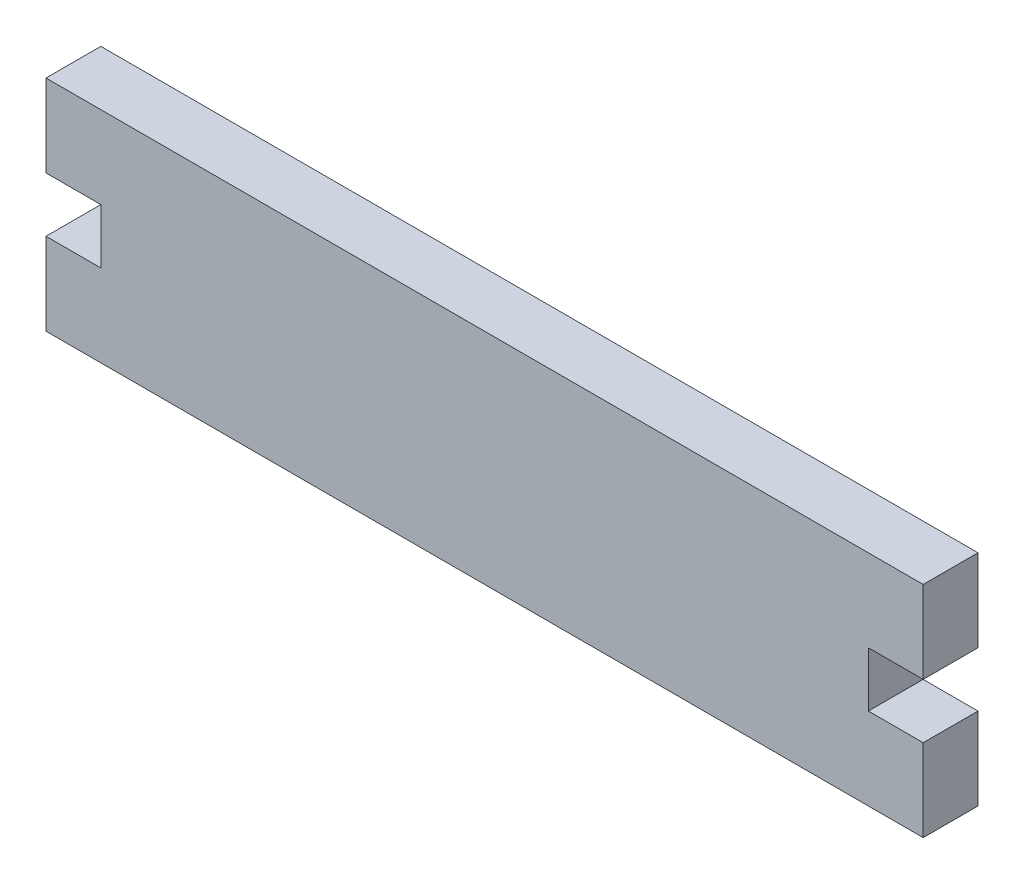
ISO-10303-21;
HEADER;
FILE_DESCRIPTION(('STEP AP214'),'2;1');
FILE_NAME('part.step','',(''),(''),'','','');
FILE_SCHEMA(('AUTOMOTIVE_DESIGN { 1 0 10303 214 1 1 1 1 }'));
ENDSEC;
DATA;
#1=APPLICATION_CONTEXT('core data for automotive mechanical design processes');
#2=APPLICATION_PROTOCOL_DEFINITION('international standard','automotive_design',2000,#1);
#3=PRODUCT_CONTEXT('',#1,'mechanical');
#4=PRODUCT('Part','Part','',(#3));
#5=PRODUCT_RELATED_PRODUCT_CATEGORY('part','',(#4));
#6=PRODUCT_DEFINITION_FORMATION('','',#4);
#7=PRODUCT_DEFINITION_CONTEXT('part definition',#1,'design');
#8=PRODUCT_DEFINITION('design','',#6,#7);
#9=PRODUCT_DEFINITION_SHAPE('','',#8);
#10=(LENGTH_UNIT() NAMED_UNIT(*) SI_UNIT(.MILLI.,.METRE.));
#11=(NAMED_UNIT(*) PLANE_ANGLE_UNIT() SI_UNIT($,.RADIAN.));
#12=(NAMED_UNIT(*) SI_UNIT($,.STERADIAN.) SOLID_ANGLE_UNIT());
#13=UNCERTAINTY_MEASURE_WITH_UNIT(LENGTH_MEASURE(1.E-05),#10,'distance_accuracy_value','');
#14=(GEOMETRIC_REPRESENTATION_CONTEXT(3) GLOBAL_UNCERTAINTY_ASSIGNED_CONTEXT((#13)) GLOBAL_UNIT_ASSIGNED_CONTEXT((#10,
#11,#12)) REPRESENTATION_CONTEXT('',''));
#15=CARTESIAN_POINT('',(0.,0.,0.));
#16=DIRECTION('',(0.,0.,1.));
#17=DIRECTION('',(1.,0.,0.));
#18=AXIS2_PLACEMENT_3D('',#15,#16,#17);
#19=CARTESIAN_POINT('',(70.,0.,5.));
#20=DIRECTION('',(0.,1.,0.));
#21=DIRECTION('',(-1.,0.,0.));
#22=AXIS2_PLACEMENT_3D('',#19,#20,#21);
#23=PLANE('',#22);
#24=DIRECTION('',(1.,0.,0.));
#25=VECTOR('',#24,1.);
#26=CARTESIAN_POINT('',(70.,0.,0.));
#27=LINE('',#26,#25);
#28=CARTESIAN_POINT('',(-5.,0.,0.));
#29=VERTEX_POINT('',#28);
#30=CARTESIAN_POINT('',(75.,0.,0.));
#31=VERTEX_POINT('',#30);
#32=EDGE_CURVE('E97',#29,#31,#27,.T.);
#33=ORIENTED_EDGE('',*,*,#32,.T.);
#34=DIRECTION('',(0.,0.,-1.));
#35=VECTOR('',#34,1.);
#36=CARTESIAN_POINT('',(75.,0.,5.));
#37=LINE('',#36,#35);
#38=CARTESIAN_POINT('',(75.,0.,5.));
#39=VERTEX_POINT('',#38);
#40=EDGE_CURVE('E11',#39,#31,#37,.T.);
#41=ORIENTED_EDGE('',*,*,#40,.F.);
#42=DIRECTION('',(1.,0.,0.));
#43=VECTOR('',#42,1.);
#44=CARTESIAN_POINT('',(0.,0.,5.));
#45=LINE('',#44,#43);
#46=CARTESIAN_POINT('',(-5.,0.,5.));
#47=VERTEX_POINT('',#46);
#48=EDGE_CURVE('E103',#47,#39,#45,.T.);
#49=ORIENTED_EDGE('',*,*,#48,.F.);
#50=DIRECTION('',(0.,0.,-1.));
#51=VECTOR('',#50,1.);
#52=CARTESIAN_POINT('',(-5.,0.,5.));
#53=LINE('',#52,#51);
#54=EDGE_CURVE('E149',#47,#29,#53,.T.);
#55=ORIENTED_EDGE('',*,*,#54,.T.);
#56=EDGE_LOOP('',(#33,#41,#49,#55));
#57=FACE_BOUND('',#56,.T.);
#58=ADVANCED_FACE('F33',(#57),#23,.F.);
#59=CARTESIAN_POINT('',(75.,0.,5.));
#60=DIRECTION('',(-1.,0.,0.));
#61=DIRECTION('',(0.,0.,1.));
#62=AXIS2_PLACEMENT_3D('',#59,#60,#61);
#63=PLANE('',#62);
#64=DIRECTION('',(0.,1.,0.));
#65=VECTOR('',#64,1.);
#66=CARTESIAN_POINT('',(75.,0.,0.));
#67=LINE('',#66,#65);
#68=CARTESIAN_POINT('',(75.,7.5,0.));
#69=VERTEX_POINT('',#68);
#70=EDGE_CURVE('E154',#31,#69,#67,.T.);
#71=ORIENTED_EDGE('',*,*,#70,.T.);
#72=DIRECTION('',(0.,0.,-1.));
#73=VECTOR('',#72,1.);
#74=CARTESIAN_POINT('',(75.,7.5,5.));
#75=LINE('',#74,#73);
#76=CARTESIAN_POINT('',(75.,7.5,5.));
#77=VERTEX_POINT('',#76);
#78=EDGE_CURVE('E41',#77,#69,#75,.T.);
#79=ORIENTED_EDGE('',*,*,#78,.F.);
#80=DIRECTION('',(0.,1.,0.));
#81=VECTOR('',#80,1.);
#82=CARTESIAN_POINT('',(75.,0.,5.));
#83=LINE('',#82,#81);
#84=EDGE_CURVE('E243',#39,#77,#83,.T.);
#85=ORIENTED_EDGE('',*,*,#84,.F.);
#86=ORIENTED_EDGE('',*,*,#40,.T.);
#87=EDGE_LOOP('',(#71,#79,#85,#86));
#88=FACE_BOUND('',#87,.T.);
#89=ADVANCED_FACE('F246',(#88),#63,.F.);
#90=CARTESIAN_POINT('',(70.,7.5,5.));
#91=DIRECTION('',(0.,-1.,0.));
#92=DIRECTION('',(1.,0.,0.));
#93=AXIS2_PLACEMENT_3D('',#90,#91,#92);
#94=PLANE('',#93);
#95=DIRECTION('',(-1.,0.,0.));
#96=VECTOR('',#95,1.);
#97=CARTESIAN_POINT('',(70.,7.5,0.));
#98=LINE('',#97,#96);
#99=CARTESIAN_POINT('',(70.,7.5,0.));
#100=VERTEX_POINT('',#99);
#101=EDGE_CURVE('E156',#69,#100,#98,.T.);
#102=ORIENTED_EDGE('',*,*,#101,.T.);
#103=DIRECTION('',(0.,0.,-1.));
#104=VECTOR('',#103,1.);
#105=CARTESIAN_POINT('',(70.,7.5,5.));
#106=LINE('',#105,#104);
#107=CARTESIAN_POINT('',(70.,7.5,5.));
#108=VERTEX_POINT('',#107);
#109=EDGE_CURVE('E194',#108,#100,#106,.T.);
#110=ORIENTED_EDGE('',*,*,#109,.F.);
#111=DIRECTION('',(-1.,0.,0.));
#112=VECTOR('',#111,1.);
#113=CARTESIAN_POINT('',(70.,7.5,5.));
#114=LINE('',#113,#112);
#115=EDGE_CURVE('E203',#77,#108,#114,.T.);
#116=ORIENTED_EDGE('',*,*,#115,.F.);
#117=ORIENTED_EDGE('',*,*,#78,.T.);
#118=EDGE_LOOP('',(#102,#110,#116,#117));
#119=FACE_BOUND('',#118,.T.);
#120=ADVANCED_FACE('F201',(#119),#94,.F.);
#121=CARTESIAN_POINT('',(70.,7.5,5.));
#122=DIRECTION('',(-1.,0.,0.));
#123=DIRECTION('',(0.,0.,1.));
#124=AXIS2_PLACEMENT_3D('',#121,#122,#123);
#125=PLANE('',#124);
#126=DIRECTION('',(0.,1.,0.));
#127=VECTOR('',#126,1.);
#128=CARTESIAN_POINT('',(70.,7.5,0.));
#129=LINE('',#128,#127);
#130=CARTESIAN_POINT('',(70.,12.5,0.));
#131=VERTEX_POINT('',#130);
#132=EDGE_CURVE('E158',#100,#131,#129,.T.);
#133=ORIENTED_EDGE('',*,*,#132,.T.);
#134=DIRECTION('',(0.,0.,-1.));
#135=VECTOR('',#134,1.);
#136=CARTESIAN_POINT('',(70.,12.5,5.));
#137=LINE('',#136,#135);
#138=CARTESIAN_POINT('',(70.,12.5,5.));
#139=VERTEX_POINT('',#138);
#140=EDGE_CURVE('E191',#139,#131,#137,.T.);
#141=ORIENTED_EDGE('',*,*,#140,.F.);
#142=DIRECTION('',(0.,1.,0.));
#143=VECTOR('',#142,1.);
#144=CARTESIAN_POINT('',(70.,7.5,5.));
#145=LINE('',#144,#143);
#146=EDGE_CURVE('E221',#108,#139,#145,.T.);
#147=ORIENTED_EDGE('',*,*,#146,.F.);
#148=ORIENTED_EDGE('',*,*,#109,.T.);
#149=EDGE_LOOP('',(#133,#141,#147,#148));
#150=FACE_BOUND('',#149,.T.);
#151=ADVANCED_FACE('F212',(#150),#125,.F.);
#152=CARTESIAN_POINT('',(70.,12.5,5.));
#153=DIRECTION('',(0.,1.,0.));
#154=DIRECTION('',(0.,0.,1.));
#155=AXIS2_PLACEMENT_3D('',#152,#153,#154);
#156=PLANE('',#155);
#157=DIRECTION('',(1.,0.,0.));
#158=VECTOR('',#157,1.);
#159=CARTESIAN_POINT('',(70.,12.5,0.));
#160=LINE('',#159,#158);
#161=CARTESIAN_POINT('',(75.,12.5,0.));
#162=VERTEX_POINT('',#161);
#163=EDGE_CURVE('E160',#131,#162,#160,.T.);
#164=ORIENTED_EDGE('',*,*,#163,.T.);
#165=DIRECTION('',(0.,0.,-1.));
#166=VECTOR('',#165,1.);
#167=CARTESIAN_POINT('',(75.,12.5,5.));
#168=LINE('',#167,#166);
#169=CARTESIAN_POINT('',(75.,12.5,5.));
#170=VERTEX_POINT('',#169);
#171=EDGE_CURVE('E188',#170,#162,#168,.T.);
#172=ORIENTED_EDGE('',*,*,#171,.F.);
#173=DIRECTION('',(1.,0.,0.));
#174=VECTOR('',#173,1.);
#175=CARTESIAN_POINT('',(70.,12.5,5.));
#176=LINE('',#175,#174);
#177=EDGE_CURVE('E218',#139,#170,#176,.T.);
#178=ORIENTED_EDGE('',*,*,#177,.F.);
#179=ORIENTED_EDGE('',*,*,#140,.T.);
#180=EDGE_LOOP('',(#164,#172,#178,#179));
#181=FACE_BOUND('',#180,.T.);
#182=ADVANCED_FACE('F216',(#181),#156,.F.);
#183=CARTESIAN_POINT('',(75.,20.,5.));
#184=DIRECTION('',(-1.,0.,0.));
#185=DIRECTION('',(0.,0.,1.));
#186=AXIS2_PLACEMENT_3D('',#183,#184,#185);
#187=PLANE('',#186);
#188=DIRECTION('',(0.,1.,0.));
#189=VECTOR('',#188,1.);
#190=CARTESIAN_POINT('',(75.,20.,0.));
#191=LINE('',#190,#189);
#192=CARTESIAN_POINT('',(75.,20.,0.));
#193=VERTEX_POINT('',#192);
#194=EDGE_CURVE('E162',#162,#193,#191,.T.);
#195=ORIENTED_EDGE('',*,*,#194,.T.);
#196=DIRECTION('',(0.,0.,-1.));
#197=VECTOR('',#196,1.);
#198=CARTESIAN_POINT('',(75.,20.,5.));
#199=LINE('',#198,#197);
#200=CARTESIAN_POINT('',(75.,20.,5.));
#201=VERTEX_POINT('',#200);
#202=EDGE_CURVE('E185',#201,#193,#199,.T.);
#203=ORIENTED_EDGE('',*,*,#202,.F.);
#204=DIRECTION('',(0.,1.,0.));
#205=VECTOR('',#204,1.);
#206=CARTESIAN_POINT('',(75.,20.,5.));
#207=LINE('',#206,#205);
#208=EDGE_CURVE('E220',#170,#201,#207,.T.);
#209=ORIENTED_EDGE('',*,*,#208,.F.);
#210=ORIENTED_EDGE('',*,*,#171,.T.);
#211=EDGE_LOOP('',(#195,#203,#209,#210));
#212=FACE_BOUND('',#211,.T.);
#213=ADVANCED_FACE('F258',(#212),#187,.F.);
#214=CARTESIAN_POINT('',(0.,20.,5.));
#215=DIRECTION('',(0.,-1.,0.));
#216=DIRECTION('',(0.,0.,-1.));
#217=AXIS2_PLACEMENT_3D('',#214,#215,#216);
#218=PLANE('',#217);
#219=DIRECTION('',(-1.,0.,0.));
#220=VECTOR('',#219,1.);
#221=CARTESIAN_POINT('',(0.,20.,0.));
#222=LINE('',#221,#220);
#223=CARTESIAN_POINT('',(-5.,20.,0.));
#224=VERTEX_POINT('',#223);
#225=EDGE_CURVE('E165',#193,#224,#222,.T.);
#226=ORIENTED_EDGE('',*,*,#225,.T.);
#227=DIRECTION('',(0.,0.,-1.));
#228=VECTOR('',#227,1.);
#229=CARTESIAN_POINT('',(-5.,20.,5.));
#230=LINE('',#229,#228);
#231=CARTESIAN_POINT('',(-5.,20.,5.));
#232=VERTEX_POINT('',#231);
#233=EDGE_CURVE('E182',#232,#224,#230,.T.);
#234=ORIENTED_EDGE('',*,*,#233,.F.);
#235=DIRECTION('',(-1.,0.,0.));
#236=VECTOR('',#235,1.);
#237=CARTESIAN_POINT('',(70.,20.,5.));
#238=LINE('',#237,#236);
#239=EDGE_CURVE('E223',#201,#232,#238,.T.);
#240=ORIENTED_EDGE('',*,*,#239,.F.);
#241=ORIENTED_EDGE('',*,*,#202,.T.);
#242=EDGE_LOOP('',(#226,#234,#240,#241));
#243=FACE_BOUND('',#242,.T.);
#244=ADVANCED_FACE('F261',(#243),#218,.F.);
#245=CARTESIAN_POINT('',(-5.,20.,5.));
#246=DIRECTION('',(1.,0.,0.));
#247=DIRECTION('',(0.,0.,-1.));
#248=AXIS2_PLACEMENT_3D('',#245,#246,#247);
#249=PLANE('',#248);
#250=DIRECTION('',(0.,-1.,0.));
#251=VECTOR('',#250,1.);
#252=CARTESIAN_POINT('',(-5.,20.,0.));
#253=LINE('',#252,#251);
#254=CARTESIAN_POINT('',(-5.,12.5,0.));
#255=VERTEX_POINT('',#254);
#256=EDGE_CURVE('E167',#224,#255,#253,.T.);
#257=ORIENTED_EDGE('',*,*,#256,.T.);
#258=DIRECTION('',(0.,0.,-1.));
#259=VECTOR('',#258,1.);
#260=CARTESIAN_POINT('',(-5.,12.5,5.));
#261=LINE('',#260,#259);
#262=CARTESIAN_POINT('',(-5.,12.5,5.));
#263=VERTEX_POINT('',#262);
#264=EDGE_CURVE('E179',#263,#255,#261,.T.);
#265=ORIENTED_EDGE('',*,*,#264,.F.);
#266=DIRECTION('',(0.,-1.,0.));
#267=VECTOR('',#266,1.);
#268=CARTESIAN_POINT('',(-5.,20.,5.));
#269=LINE('',#268,#267);
#270=EDGE_CURVE('E229',#232,#263,#269,.T.);
#271=ORIENTED_EDGE('',*,*,#270,.F.);
#272=ORIENTED_EDGE('',*,*,#233,.T.);
#273=EDGE_LOOP('',(#257,#265,#271,#272));
#274=FACE_BOUND('',#273,.T.);
#275=ADVANCED_FACE('F235',(#274),#249,.F.);
#276=CARTESIAN_POINT('',(0.,12.5,5.));
#277=DIRECTION('',(0.,1.,0.));
#278=DIRECTION('',(0.,0.,1.));
#279=AXIS2_PLACEMENT_3D('',#276,#277,#278);
#280=PLANE('',#279);
#281=DIRECTION('',(1.,0.,0.));
#282=VECTOR('',#281,1.);
#283=CARTESIAN_POINT('',(0.,12.5,0.));
#284=LINE('',#283,#282);
#285=CARTESIAN_POINT('',(0.,12.5,0.));
#286=VERTEX_POINT('',#285);
#287=EDGE_CURVE('E169',#255,#286,#284,.T.);
#288=ORIENTED_EDGE('',*,*,#287,.T.);
#289=DIRECTION('',(0.,0.,-1.));
#290=VECTOR('',#289,1.);
#291=CARTESIAN_POINT('',(0.,12.5,5.));
#292=LINE('',#291,#290);
#293=CARTESIAN_POINT('',(0.,12.5,5.));
#294=VERTEX_POINT('',#293);
#295=EDGE_CURVE('E144',#294,#286,#292,.T.);
#296=ORIENTED_EDGE('',*,*,#295,.F.);
#297=DIRECTION('',(1.,0.,0.));
#298=VECTOR('',#297,1.);
#299=CARTESIAN_POINT('',(0.,12.5,5.));
#300=LINE('',#299,#298);
#301=EDGE_CURVE('E135',#263,#294,#300,.T.);
#302=ORIENTED_EDGE('',*,*,#301,.F.);
#303=ORIENTED_EDGE('',*,*,#264,.T.);
#304=EDGE_LOOP('',(#288,#296,#302,#303));
#305=FACE_BOUND('',#304,.T.);
#306=ADVANCED_FACE('F239',(#305),#280,.F.);
#307=CARTESIAN_POINT('',(0.,7.5,5.));
#308=DIRECTION('',(1.,0.,0.));
#309=DIRECTION('',(0.,0.,-1.));
#310=AXIS2_PLACEMENT_3D('',#307,#308,#309);
#311=PLANE('',#310);
#312=DIRECTION('',(0.,-1.,0.));
#313=VECTOR('',#312,1.);
#314=CARTESIAN_POINT('',(0.,7.5,0.));
#315=LINE('',#314,#313);
#316=CARTESIAN_POINT('',(0.,7.5,0.));
#317=VERTEX_POINT('',#316);
#318=EDGE_CURVE('E143',#286,#317,#315,.T.);
#319=ORIENTED_EDGE('',*,*,#318,.T.);
#320=DIRECTION('',(0.,0.,-1.));
#321=VECTOR('',#320,1.);
#322=CARTESIAN_POINT('',(0.,7.5,5.));
#323=LINE('',#322,#321);
#324=CARTESIAN_POINT('',(0.,7.5,5.));
#325=VERTEX_POINT('',#324);
#326=EDGE_CURVE('E140',#325,#317,#323,.T.);
#327=ORIENTED_EDGE('',*,*,#326,.F.);
#328=DIRECTION('',(0.,-1.,0.));
#329=VECTOR('',#328,1.);
#330=CARTESIAN_POINT('',(0.,7.5,5.));
#331=LINE('',#330,#329);
#332=EDGE_CURVE('E129',#294,#325,#331,.T.);
#333=ORIENTED_EDGE('',*,*,#332,.F.);
#334=ORIENTED_EDGE('',*,*,#295,.T.);
#335=EDGE_LOOP('',(#319,#327,#333,#334));
#336=FACE_BOUND('',#335,.T.);
#337=ADVANCED_FACE('F141',(#336),#311,.F.);
#338=CARTESIAN_POINT('',(0.,7.5,5.));
#339=DIRECTION('',(0.,-1.,0.));
#340=DIRECTION('',(1.,0.,0.));
#341=AXIS2_PLACEMENT_3D('',#338,#339,#340);
#342=PLANE('',#341);
#343=DIRECTION('',(-1.,0.,0.));
#344=VECTOR('',#343,1.);
#345=CARTESIAN_POINT('',(0.,7.5,0.));
#346=LINE('',#345,#344);
#347=CARTESIAN_POINT('',(-5.,7.5,0.));
#348=VERTEX_POINT('',#347);
#349=EDGE_CURVE('E90',#317,#348,#346,.T.);
#350=ORIENTED_EDGE('',*,*,#349,.T.);
#351=DIRECTION('',(0.,0.,-1.));
#352=VECTOR('',#351,1.);
#353=CARTESIAN_POINT('',(-5.,7.5,5.));
#354=LINE('',#353,#352);
#355=CARTESIAN_POINT('',(-5.,7.5,5.));
#356=VERTEX_POINT('',#355);
#357=EDGE_CURVE('E145',#356,#348,#354,.T.);
#358=ORIENTED_EDGE('',*,*,#357,.F.);
#359=DIRECTION('',(-1.,0.,0.));
#360=VECTOR('',#359,1.);
#361=CARTESIAN_POINT('',(0.,7.5,5.));
#362=LINE('',#361,#360);
#363=EDGE_CURVE('E133',#325,#356,#362,.T.);
#364=ORIENTED_EDGE('',*,*,#363,.F.);
#365=ORIENTED_EDGE('',*,*,#326,.T.);
#366=EDGE_LOOP('',(#350,#358,#364,#365));
#367=FACE_BOUND('',#366,.T.);
#368=ADVANCED_FACE('F147',(#367),#342,.F.);
#369=CARTESIAN_POINT('',(-5.,0.,5.));
#370=DIRECTION('',(1.,0.,0.));
#371=DIRECTION('',(0.,0.,-1.));
#372=AXIS2_PLACEMENT_3D('',#369,#370,#371);
#373=PLANE('',#372);
#374=DIRECTION('',(0.,-1.,0.));
#375=VECTOR('',#374,1.);
#376=CARTESIAN_POINT('',(-5.,0.,0.));
#377=LINE('',#376,#375);
#378=EDGE_CURVE('E173',#348,#29,#377,.T.);
#379=ORIENTED_EDGE('',*,*,#378,.T.);
#380=ORIENTED_EDGE('',*,*,#54,.F.);
#381=DIRECTION('',(0.,-1.,0.));
#382=VECTOR('',#381,1.);
#383=CARTESIAN_POINT('',(-5.,0.,5.));
#384=LINE('',#383,#382);
#385=EDGE_CURVE('E49',#356,#47,#384,.T.);
#386=ORIENTED_EDGE('',*,*,#385,.F.);
#387=ORIENTED_EDGE('',*,*,#357,.T.);
#388=EDGE_LOOP('',(#379,#380,#386,#387));
#389=FACE_BOUND('',#388,.T.);
#390=ADVANCED_FACE('F241',(#389),#373,.F.);
#391=CARTESIAN_POINT('',(0.,0.,5.));
#392=DIRECTION('',(0.,0.,-1.));
#393=DIRECTION('',(-1.,0.,0.));
#394=AXIS2_PLACEMENT_3D('',#391,#392,#393);
#395=PLANE('',#394);
#396=ORIENTED_EDGE('',*,*,#48,.T.);
#397=ORIENTED_EDGE('',*,*,#84,.T.);
#398=ORIENTED_EDGE('',*,*,#115,.T.);
#399=ORIENTED_EDGE('',*,*,#146,.T.);
#400=ORIENTED_EDGE('',*,*,#177,.T.);
#401=ORIENTED_EDGE('',*,*,#208,.T.);
#402=ORIENTED_EDGE('',*,*,#239,.T.);
#403=ORIENTED_EDGE('',*,*,#270,.T.);
#404=ORIENTED_EDGE('',*,*,#301,.T.);
#405=ORIENTED_EDGE('',*,*,#332,.T.);
#406=ORIENTED_EDGE('',*,*,#363,.T.);
#407=ORIENTED_EDGE('',*,*,#385,.T.);
#408=EDGE_LOOP('',(#396,#397,#398,#399,#400,#401,#402,#403,#404,#405,#406,#407));
#409=FACE_BOUND('',#408,.T.);
#410=ADVANCED_FACE('F131',(#409),#395,.F.);
#411=CARTESIAN_POINT('',(0.,0.,0.));
#412=DIRECTION('',(0.,0.,-1.));
#413=DIRECTION('',(-1.,0.,0.));
#414=AXIS2_PLACEMENT_3D('',#411,#412,#413);
#415=PLANE('',#414);
#416=ORIENTED_EDGE('',*,*,#32,.F.);
#417=ORIENTED_EDGE('',*,*,#378,.F.);
#418=ORIENTED_EDGE('',*,*,#349,.F.);
#419=ORIENTED_EDGE('',*,*,#318,.F.);
#420=ORIENTED_EDGE('',*,*,#287,.F.);
#421=ORIENTED_EDGE('',*,*,#256,.F.);
#422=ORIENTED_EDGE('',*,*,#225,.F.);
#423=ORIENTED_EDGE('',*,*,#194,.F.);
#424=ORIENTED_EDGE('',*,*,#163,.F.);
#425=ORIENTED_EDGE('',*,*,#132,.F.);
#426=ORIENTED_EDGE('',*,*,#101,.F.);
#427=ORIENTED_EDGE('',*,*,#70,.F.);
#428=EDGE_LOOP('',(#416,#417,#418,#419,#420,#421,#422,#423,#424,#425,#426,#427));
#429=FACE_BOUND('',#428,.T.);
#430=ADVANCED_FACE('F207',(#429),#415,.T.);
#431=CLOSED_SHELL('',(#58,#89,#120,#151,#182,#213,#244,#275,#306,#337,#368,#390,#410,#430));
#432=MANIFOLD_SOLID_BREP('B2',#431);
#433=ADVANCED_BREP_SHAPE_REPRESENTATION('',(#18,#432),#14);
#434=SHAPE_DEFINITION_REPRESENTATION(#9,#433);
ENDSEC;
END-ISO-10303-21;
